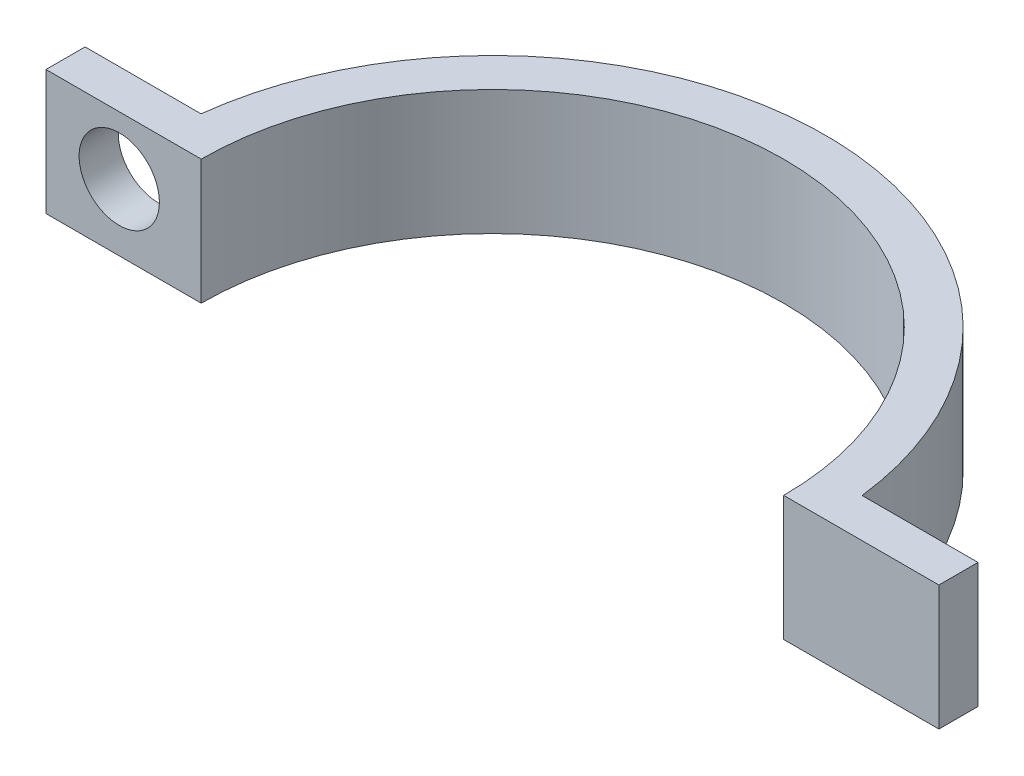
ISO-10303-21;
HEADER;
FILE_DESCRIPTION(('STEP AP214'),'2;1');
FILE_NAME('part.step','',(''),(''),'','','');
FILE_SCHEMA(('AUTOMOTIVE_DESIGN { 1 0 10303 214 1 1 1 1 }'));
ENDSEC;
DATA;
#1=APPLICATION_CONTEXT('core data for automotive mechanical design processes');
#2=APPLICATION_PROTOCOL_DEFINITION('international standard','automotive_design',2000,#1);
#3=PRODUCT_CONTEXT('',#1,'mechanical');
#4=PRODUCT('Part','Part','',(#3));
#5=PRODUCT_RELATED_PRODUCT_CATEGORY('part','',(#4));
#6=PRODUCT_DEFINITION_FORMATION('','',#4);
#7=PRODUCT_DEFINITION_CONTEXT('part definition',#1,'design');
#8=PRODUCT_DEFINITION('design','',#6,#7);
#9=PRODUCT_DEFINITION_SHAPE('','',#8);
#10=(LENGTH_UNIT() NAMED_UNIT(*) SI_UNIT(.MILLI.,.METRE.));
#11=(NAMED_UNIT(*) PLANE_ANGLE_UNIT() SI_UNIT($,.RADIAN.));
#12=(NAMED_UNIT(*) SI_UNIT($,.STERADIAN.) SOLID_ANGLE_UNIT());
#13=UNCERTAINTY_MEASURE_WITH_UNIT(LENGTH_MEASURE(1.E-05),#10,'distance_accuracy_value','');
#14=(GEOMETRIC_REPRESENTATION_CONTEXT(3) GLOBAL_UNCERTAINTY_ASSIGNED_CONTEXT((#13)) GLOBAL_UNIT_ASSIGNED_CONTEXT((#10,
#11,#12)) REPRESENTATION_CONTEXT('',''));
#15=CARTESIAN_POINT('',(0.,0.,0.));
#16=DIRECTION('',(0.,0.,1.));
#17=DIRECTION('',(1.,0.,0.));
#18=AXIS2_PLACEMENT_3D('',#15,#16,#17);
#19=CARTESIAN_POINT('',(0.,1.5,0.));
#20=DIRECTION('',(0.,-1.,0.));
#21=DIRECTION('',(0.,0.,-1.));
#22=AXIS2_PLACEMENT_3D('',#19,#20,#21);
#23=CYLINDRICAL_SURFACE('',#22,3.5);
#24=CARTESIAN_POINT('',(0.,0.,0.));
#25=DIRECTION('',(0.,-1.,0.));
#26=DIRECTION('',(0.,0.,1.));
#27=AXIS2_PLACEMENT_3D('',#24,#25,#26);
#28=CIRCLE('',#27,3.5);
#29=CARTESIAN_POINT('',(-3.5,0.,0.));
#30=VERTEX_POINT('',#29);
#31=CARTESIAN_POINT('',(3.5,0.,0.));
#32=VERTEX_POINT('',#31);
#33=EDGE_CURVE('E129',#30,#32,#28,.T.);
#34=ORIENTED_EDGE('',*,*,#33,.T.);
#35=DIRECTION('',(0.,-1.,0.));
#36=VECTOR('',#35,1.);
#37=CARTESIAN_POINT('',(3.5,1.5,0.));
#38=LINE('',#37,#36);
#39=CARTESIAN_POINT('',(3.5,1.5,0.));
#40=VERTEX_POINT('',#39);
#41=EDGE_CURVE('E11',#40,#32,#38,.T.);
#42=ORIENTED_EDGE('',*,*,#41,.F.);
#43=CARTESIAN_POINT('',(0.,1.5,0.));
#44=DIRECTION('',(0.,-1.,0.));
#45=DIRECTION('',(0.,0.,1.));
#46=AXIS2_PLACEMENT_3D('',#43,#44,#45);
#47=CIRCLE('',#46,3.5);
#48=CARTESIAN_POINT('',(-3.5,1.5,0.));
#49=VERTEX_POINT('',#48);
#50=EDGE_CURVE('E144',#49,#40,#47,.T.);
#51=ORIENTED_EDGE('',*,*,#50,.F.);
#52=DIRECTION('',(0.,-1.,0.));
#53=VECTOR('',#52,1.);
#54=CARTESIAN_POINT('',(-3.5,1.5,0.));
#55=LINE('',#54,#53);
#56=EDGE_CURVE('E125',#49,#30,#55,.T.);
#57=ORIENTED_EDGE('',*,*,#56,.T.);
#58=EDGE_LOOP('',(#34,#42,#51,#57));
#59=FACE_BOUND('',#58,.T.);
#60=ADVANCED_FACE('F33',(#59),#23,.F.);
#61=CARTESIAN_POINT('',(5.36548236911544,1.5,0.));
#62=DIRECTION('',(0.,0.,-1.));
#63=DIRECTION('',(-1.,0.,0.));
#64=AXIS2_PLACEMENT_3D('',#61,#62,#63);
#65=PLANE('',#64);
#66=DIRECTION('',(1.,0.,0.));
#67=VECTOR('',#66,1.);
#68=CARTESIAN_POINT('',(5.36548236911544,0.,0.));
#69=LINE('',#68,#67);
#70=CARTESIAN_POINT('',(5.36548236911544,0.,0.));
#71=VERTEX_POINT('',#70);
#72=EDGE_CURVE('E132',#32,#71,#69,.T.);
#73=ORIENTED_EDGE('',*,*,#72,.T.);
#74=DIRECTION('',(0.,-1.,0.));
#75=VECTOR('',#74,1.);
#76=CARTESIAN_POINT('',(5.36548236911544,1.5,0.));
#77=LINE('',#76,#75);
#78=CARTESIAN_POINT('',(5.36548236911544,1.5,0.));
#79=VERTEX_POINT('',#78);
#80=EDGE_CURVE('E41',#79,#71,#77,.T.);
#81=ORIENTED_EDGE('',*,*,#80,.F.);
#82=DIRECTION('',(1.,0.,0.));
#83=VECTOR('',#82,1.);
#84=CARTESIAN_POINT('',(5.36548236911544,1.5,0.));
#85=LINE('',#84,#83);
#86=EDGE_CURVE('E92',#40,#79,#85,.T.);
#87=ORIENTED_EDGE('',*,*,#86,.F.);
#88=ORIENTED_EDGE('',*,*,#41,.T.);
#89=EDGE_LOOP('',(#73,#81,#87,#88));
#90=FACE_BOUND('',#89,.T.);
#91=ADVANCED_FACE('F197',(#90),#65,.F.);
#92=CARTESIAN_POINT('',(5.36548236911544,1.5,0.));
#93=DIRECTION('',(-1.,0.,0.));
#94=DIRECTION('',(0.,0.,1.));
#95=AXIS2_PLACEMENT_3D('',#92,#93,#94);
#96=PLANE('',#95);
#97=DIRECTION('',(0.,0.,-1.));
#98=VECTOR('',#97,1.);
#99=CARTESIAN_POINT('',(5.36548236911544,0.,0.));
#100=LINE('',#99,#98);
#101=CARTESIAN_POINT('',(5.36548236911544,0.,-0.469939431595562));
#102=VERTEX_POINT('',#101);
#103=EDGE_CURVE('E135',#71,#102,#100,.T.);
#104=ORIENTED_EDGE('',*,*,#103,.T.);
#105=DIRECTION('',(0.,-1.,0.));
#106=VECTOR('',#105,1.);
#107=CARTESIAN_POINT('',(5.36548236911544,1.5,-0.469939431595562));
#108=LINE('',#107,#106);
#109=CARTESIAN_POINT('',(5.36548236911544,1.5,-0.469939431595562));
#110=VERTEX_POINT('',#109);
#111=EDGE_CURVE('E151',#110,#102,#108,.T.);
#112=ORIENTED_EDGE('',*,*,#111,.F.);
#113=DIRECTION('',(0.,0.,-1.));
#114=VECTOR('',#113,1.);
#115=CARTESIAN_POINT('',(5.36548236911544,1.5,0.));
#116=LINE('',#115,#114);
#117=EDGE_CURVE('E159',#79,#110,#116,.T.);
#118=ORIENTED_EDGE('',*,*,#117,.F.);
#119=ORIENTED_EDGE('',*,*,#80,.T.);
#120=EDGE_LOOP('',(#104,#112,#118,#119));
#121=FACE_BOUND('',#120,.T.);
#122=ADVANCED_FACE('F157',(#121),#96,.F.);
#123=CARTESIAN_POINT('',(5.36548236911544,1.5,-0.469939431595562));
#124=DIRECTION('',(0.,0.,1.));
#125=DIRECTION('',(1.,0.,0.));
#126=AXIS2_PLACEMENT_3D('',#123,#124,#125);
#127=PLANE('',#126);
#128=DIRECTION('',(-1.,0.,0.));
#129=VECTOR('',#128,1.);
#130=CARTESIAN_POINT('',(5.36548236911544,0.,-0.469939431595562));
#131=LINE('',#130,#129);
#132=CARTESIAN_POINT('',(3.97229869604888,0.,-0.469939431595562));
#133=VERTEX_POINT('',#132);
#134=EDGE_CURVE('E137',#102,#133,#131,.T.);
#135=ORIENTED_EDGE('',*,*,#134,.T.);
#136=DIRECTION('',(0.,-1.,0.));
#137=VECTOR('',#136,1.);
#138=CARTESIAN_POINT('',(3.97229869604888,1.5,-0.469939431595562));
#139=LINE('',#138,#137);
#140=CARTESIAN_POINT('',(3.97229869604888,1.5,-0.469939431595562));
#141=VERTEX_POINT('',#140);
#142=EDGE_CURVE('E148',#141,#133,#139,.T.);
#143=ORIENTED_EDGE('',*,*,#142,.F.);
#144=DIRECTION('',(-1.,0.,0.));
#145=VECTOR('',#144,1.);
#146=CARTESIAN_POINT('',(5.36548236911544,1.5,-0.469939431595562));
#147=LINE('',#146,#145);
#148=EDGE_CURVE('E171',#110,#141,#147,.T.);
#149=ORIENTED_EDGE('',*,*,#148,.F.);
#150=ORIENTED_EDGE('',*,*,#111,.T.);
#151=EDGE_LOOP('',(#135,#143,#149,#150));
#152=FACE_BOUND('',#151,.T.);
#153=ADVANCED_FACE('F167',(#152),#127,.F.);
#154=CARTESIAN_POINT('',(0.,1.5,0.));
#155=DIRECTION('',(0.,-1.,0.));
#156=DIRECTION('',(0.,0.,-1.));
#157=AXIS2_PLACEMENT_3D('',#154,#155,#156);
#158=CYLINDRICAL_SURFACE('',#157,4.);
#159=CARTESIAN_POINT('',(0.,0.,0.));
#160=DIRECTION('',(0.,1.,0.));
#161=DIRECTION('',(0.,0.,1.));
#162=AXIS2_PLACEMENT_3D('',#159,#160,#161);
#163=CIRCLE('',#162,4.);
#164=CARTESIAN_POINT('',(-3.97229869604888,0.,-0.469939431595534));
#165=VERTEX_POINT('',#164);
#166=EDGE_CURVE('E139',#133,#165,#163,.T.);
#167=ORIENTED_EDGE('',*,*,#166,.T.);
#168=DIRECTION('',(0.,-1.,0.));
#169=VECTOR('',#168,1.);
#170=CARTESIAN_POINT('',(-3.97229869604888,1.5,-0.469939431595534));
#171=LINE('',#170,#169);
#172=CARTESIAN_POINT('',(-3.97229869604888,1.5,-0.469939431595534));
#173=VERTEX_POINT('',#172);
#174=EDGE_CURVE('E120',#173,#165,#171,.T.);
#175=ORIENTED_EDGE('',*,*,#174,.F.);
#176=CARTESIAN_POINT('',(0.,1.5,0.));
#177=DIRECTION('',(0.,1.,0.));
#178=DIRECTION('',(0.,0.,1.));
#179=AXIS2_PLACEMENT_3D('',#176,#177,#178);
#180=CIRCLE('',#179,4.);
#181=EDGE_CURVE('E111',#141,#173,#180,.T.);
#182=ORIENTED_EDGE('',*,*,#181,.F.);
#183=ORIENTED_EDGE('',*,*,#142,.T.);
#184=EDGE_LOOP('',(#167,#175,#182,#183));
#185=FACE_BOUND('',#184,.T.);
#186=ADVANCED_FACE('F170',(#185),#158,.T.);
#187=CARTESIAN_POINT('',(-5.36548236911544,1.5,-0.469939431595525));
#188=DIRECTION('',(0.,0.,1.));
#189=DIRECTION('',(1.,0.,0.));
#190=AXIS2_PLACEMENT_3D('',#187,#188,#189);
#191=PLANE('',#190);
#192=CARTESIAN_POINT('',(-4.48522201701037,0.798824847976115,-0.469939431595531));
#193=DIRECTION('',(0.,0.,1.));
#194=DIRECTION('',(1.,0.,0.));
#195=AXIS2_PLACEMENT_3D('',#192,#193,#194);
#196=CIRCLE('',#195,0.482388484888885);
#197=CARTESIAN_POINT('',(-4.00283353212149,0.798824847976115,-0.469939431595534));
#198=VERTEX_POINT('',#197);
#199=EDGE_CURVE('E133',#198,#198,#196,.T.);
#200=ORIENTED_EDGE('',*,*,#199,.T.);
#201=EDGE_LOOP('',(#200));
#202=FACE_BOUND('',#201,.T.);
#203=DIRECTION('',(-1.,0.,0.));
#204=VECTOR('',#203,1.);
#205=CARTESIAN_POINT('',(-5.36548236911544,0.,-0.469939431595525));
#206=LINE('',#205,#204);
#207=CARTESIAN_POINT('',(-5.36548236911544,0.,-0.469939431595525));
#208=VERTEX_POINT('',#207);
#209=EDGE_CURVE('E119',#165,#208,#206,.T.);
#210=ORIENTED_EDGE('',*,*,#209,.T.);
#211=DIRECTION('',(0.,-1.,0.));
#212=VECTOR('',#211,1.);
#213=CARTESIAN_POINT('',(-5.36548236911544,1.5,-0.469939431595525));
#214=LINE('',#213,#212);
#215=CARTESIAN_POINT('',(-5.36548236911544,1.5,-0.469939431595525));
#216=VERTEX_POINT('',#215);
#217=EDGE_CURVE('E116',#216,#208,#214,.T.);
#218=ORIENTED_EDGE('',*,*,#217,.F.);
#219=DIRECTION('',(-1.,0.,0.));
#220=VECTOR('',#219,1.);
#221=CARTESIAN_POINT('',(-5.36548236911544,1.5,-0.469939431595525));
#222=LINE('',#221,#220);
#223=EDGE_CURVE('E105',#173,#216,#222,.T.);
#224=ORIENTED_EDGE('',*,*,#223,.F.);
#225=ORIENTED_EDGE('',*,*,#174,.T.);
#226=EDGE_LOOP('',(#210,#218,#224,#225));
#227=FACE_BOUND('',#226,.T.);
#228=ADVANCED_FACE('F117',(#202,#227),#191,.F.);
#229=CARTESIAN_POINT('',(-5.36548236911544,1.5,0.));
#230=DIRECTION('',(1.,0.,0.));
#231=DIRECTION('',(0.,0.,-1.));
#232=AXIS2_PLACEMENT_3D('',#229,#230,#231);
#233=PLANE('',#232);
#234=DIRECTION('',(0.,0.,1.));
#235=VECTOR('',#234,1.);
#236=CARTESIAN_POINT('',(-5.36548236911544,0.,0.));
#237=LINE('',#236,#235);
#238=CARTESIAN_POINT('',(-5.36548236911544,0.,0.));
#239=VERTEX_POINT('',#238);
#240=EDGE_CURVE('E78',#208,#239,#237,.T.);
#241=ORIENTED_EDGE('',*,*,#240,.T.);
#242=DIRECTION('',(0.,-1.,0.));
#243=VECTOR('',#242,1.);
#244=CARTESIAN_POINT('',(-5.36548236911544,1.5,0.));
#245=LINE('',#244,#243);
#246=CARTESIAN_POINT('',(-5.36548236911544,1.5,0.));
#247=VERTEX_POINT('',#246);
#248=EDGE_CURVE('E121',#247,#239,#245,.T.);
#249=ORIENTED_EDGE('',*,*,#248,.F.);
#250=DIRECTION('',(0.,0.,1.));
#251=VECTOR('',#250,1.);
#252=CARTESIAN_POINT('',(-5.36548236911544,1.5,0.));
#253=LINE('',#252,#251);
#254=EDGE_CURVE('E109',#216,#247,#253,.T.);
#255=ORIENTED_EDGE('',*,*,#254,.F.);
#256=ORIENTED_EDGE('',*,*,#217,.T.);
#257=EDGE_LOOP('',(#241,#249,#255,#256));
#258=FACE_BOUND('',#257,.T.);
#259=ADVANCED_FACE('F123',(#258),#233,.F.);
#260=CARTESIAN_POINT('',(-5.36548236911544,1.5,0.));
#261=DIRECTION('',(0.,0.,-1.));
#262=DIRECTION('',(-1.,0.,0.));
#263=AXIS2_PLACEMENT_3D('',#260,#261,#262);
#264=PLANE('',#263);
#265=CARTESIAN_POINT('',(-4.48522201701037,0.798824847976115,0.));
#266=DIRECTION('',(0.,0.,1.));
#267=DIRECTION('',(1.,0.,0.));
#268=AXIS2_PLACEMENT_3D('',#265,#266,#267);
#269=CIRCLE('',#268,0.482388484888885);
#270=CARTESIAN_POINT('',(-4.00283353212149,0.798824847976115,0.));
#271=VERTEX_POINT('',#270);
#272=EDGE_CURVE('E179',#271,#271,#269,.T.);
#273=ORIENTED_EDGE('',*,*,#272,.F.);
#274=EDGE_LOOP('',(#273));
#275=FACE_BOUND('',#274,.T.);
#276=DIRECTION('',(1.,0.,0.));
#277=VECTOR('',#276,1.);
#278=CARTESIAN_POINT('',(-5.36548236911544,0.,0.));
#279=LINE('',#278,#277);
#280=EDGE_CURVE('E84',#239,#30,#279,.T.);
#281=ORIENTED_EDGE('',*,*,#280,.T.);
#282=ORIENTED_EDGE('',*,*,#56,.F.);
#283=DIRECTION('',(1.,0.,0.));
#284=VECTOR('',#283,1.);
#285=CARTESIAN_POINT('',(-5.36548236911544,1.5,0.));
#286=LINE('',#285,#284);
#287=EDGE_CURVE('E49',#247,#49,#286,.T.);
#288=ORIENTED_EDGE('',*,*,#287,.F.);
#289=ORIENTED_EDGE('',*,*,#248,.T.);
#290=EDGE_LOOP('',(#281,#282,#288,#289));
#291=FACE_BOUND('',#290,.T.);
#292=ADVANCED_FACE('F186',(#275,#291),#264,.F.);
#293=CARTESIAN_POINT('',(0.,1.5,0.));
#294=DIRECTION('',(0.,1.,0.));
#295=DIRECTION('',(0.,0.,1.));
#296=AXIS2_PLACEMENT_3D('',#293,#294,#295);
#297=PLANE('',#296);
#298=ORIENTED_EDGE('',*,*,#50,.T.);
#299=ORIENTED_EDGE('',*,*,#86,.T.);
#300=ORIENTED_EDGE('',*,*,#117,.T.);
#301=ORIENTED_EDGE('',*,*,#148,.T.);
#302=ORIENTED_EDGE('',*,*,#181,.T.);
#303=ORIENTED_EDGE('',*,*,#223,.T.);
#304=ORIENTED_EDGE('',*,*,#254,.T.);
#305=ORIENTED_EDGE('',*,*,#287,.T.);
#306=EDGE_LOOP('',(#298,#299,#300,#301,#302,#303,#304,#305));
#307=FACE_BOUND('',#306,.T.);
#308=ADVANCED_FACE('F107',(#307),#297,.T.);
#309=CARTESIAN_POINT('',(0.,0.,0.));
#310=DIRECTION('',(0.,1.,0.));
#311=DIRECTION('',(0.,0.,1.));
#312=AXIS2_PLACEMENT_3D('',#309,#310,#311);
#313=PLANE('',#312);
#314=ORIENTED_EDGE('',*,*,#33,.F.);
#315=ORIENTED_EDGE('',*,*,#280,.F.);
#316=ORIENTED_EDGE('',*,*,#240,.F.);
#317=ORIENTED_EDGE('',*,*,#209,.F.);
#318=ORIENTED_EDGE('',*,*,#166,.F.);
#319=ORIENTED_EDGE('',*,*,#134,.F.);
#320=ORIENTED_EDGE('',*,*,#103,.F.);
#321=ORIENTED_EDGE('',*,*,#72,.F.);
#322=EDGE_LOOP('',(#314,#315,#316,#317,#318,#319,#320,#321));
#323=FACE_BOUND('',#322,.T.);
#324=ADVANCED_FACE('F163',(#323),#313,.F.);
#325=CARTESIAN_POINT('',(-4.48522201701037,0.798824847976115,-0.47));
#326=DIRECTION('',(0.,0.,1.));
#327=DIRECTION('',(1.,0.,0.));
#328=AXIS2_PLACEMENT_3D('',#325,#326,#327);
#329=CYLINDRICAL_SURFACE('',#328,0.482388484888885);
#330=ORIENTED_EDGE('',*,*,#272,.T.);
#331=EDGE_LOOP('',(#330));
#332=FACE_BOUND('',#331,.T.);
#333=ORIENTED_EDGE('',*,*,#199,.F.);
#334=EDGE_LOOP('',(#333));
#335=FACE_BOUND('',#334,.T.);
#336=ADVANCED_FACE('F183',(#332,#335),#329,.F.);
#337=CLOSED_SHELL('',(#60,#91,#122,#153,#186,#228,#259,#292,#308,#324,#336));
#338=MANIFOLD_SOLID_BREP('B2',#337);
#339=ADVANCED_BREP_SHAPE_REPRESENTATION('',(#18,#338),#14);
#340=SHAPE_DEFINITION_REPRESENTATION(#9,#339);
ENDSEC;
END-ISO-10303-21;
